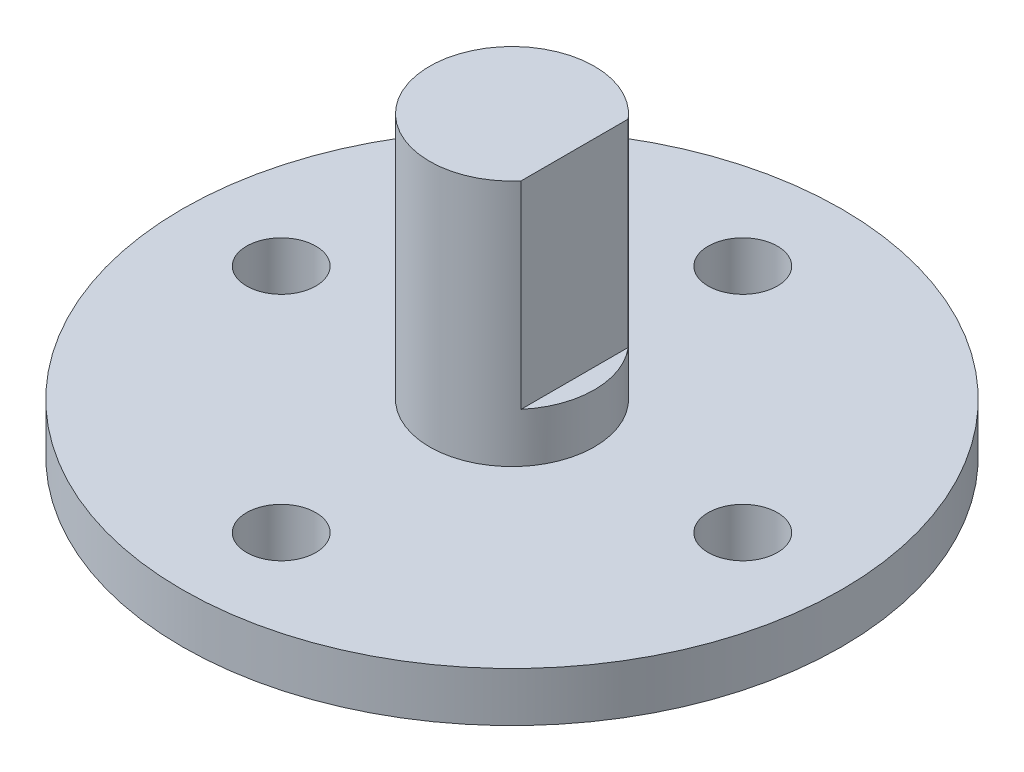
ISO-10303-21;
HEADER;
FILE_DESCRIPTION(('STEP AP214'),'2;1');
FILE_NAME('part.step','',(''),(''),'','','');
FILE_SCHEMA(('AUTOMOTIVE_DESIGN { 1 0 10303 214 1 1 1 1 }'));
ENDSEC;
DATA;
#1=APPLICATION_CONTEXT('core data for automotive mechanical design processes');
#2=APPLICATION_PROTOCOL_DEFINITION('international standard','automotive_design',2000,#1);
#3=PRODUCT_CONTEXT('',#1,'mechanical');
#4=PRODUCT('Part','Part','',(#3));
#5=PRODUCT_RELATED_PRODUCT_CATEGORY('part','',(#4));
#6=PRODUCT_DEFINITION_FORMATION('','',#4);
#7=PRODUCT_DEFINITION_CONTEXT('part definition',#1,'design');
#8=PRODUCT_DEFINITION('design','',#6,#7);
#9=PRODUCT_DEFINITION_SHAPE('','',#8);
#10=(LENGTH_UNIT() NAMED_UNIT(*) SI_UNIT(.MILLI.,.METRE.));
#11=(NAMED_UNIT(*) PLANE_ANGLE_UNIT() SI_UNIT($,.RADIAN.));
#12=(NAMED_UNIT(*) SI_UNIT($,.STERADIAN.) SOLID_ANGLE_UNIT());
#13=UNCERTAINTY_MEASURE_WITH_UNIT(LENGTH_MEASURE(1.E-05),#10,'distance_accuracy_value','');
#14=(GEOMETRIC_REPRESENTATION_CONTEXT(3) GLOBAL_UNCERTAINTY_ASSIGNED_CONTEXT((#13)) GLOBAL_UNIT_ASSIGNED_CONTEXT((#10,
#11,#12)) REPRESENTATION_CONTEXT('',''));
#15=CARTESIAN_POINT('',(0.,0.,0.));
#16=DIRECTION('',(0.,0.,1.));
#17=DIRECTION('',(1.,0.,0.));
#18=AXIS2_PLACEMENT_3D('',#15,#16,#17);
#19=CARTESIAN_POINT('',(0.,3.,0.));
#20=DIRECTION('',(0.,1.,0.));
#21=DIRECTION('',(0.,0.,1.));
#22=AXIS2_PLACEMENT_3D('',#19,#20,#21);
#23=PLANE('',#22);
#24=CARTESIAN_POINT('',(0.,3.,0.));
#25=DIRECTION('',(0.,1.,0.));
#26=DIRECTION('',(0.,0.,1.));
#27=AXIS2_PLACEMENT_3D('',#24,#25,#26);
#28=CIRCLE('',#27,5.);
#29=CARTESIAN_POINT('',(0.,3.,5.));
#30=VERTEX_POINT('',#29);
#31=EDGE_CURVE('E77',#30,#30,#28,.T.);
#32=ORIENTED_EDGE('',*,*,#31,.F.);
#33=EDGE_LOOP('',(#32));
#34=FACE_BOUND('',#33,.T.);
#35=CARTESIAN_POINT('',(14.,3.,0.));
#36=DIRECTION('',(0.,1.,0.));
#37=DIRECTION('',(0.,0.,1.));
#38=AXIS2_PLACEMENT_3D('',#35,#36,#37);
#39=CIRCLE('',#38,2.1);
#40=CARTESIAN_POINT('',(14.,3.,2.1000000000001));
#41=VERTEX_POINT('',#40);
#42=EDGE_CURVE('E92',#41,#41,#39,.T.);
#43=ORIENTED_EDGE('',*,*,#42,.F.);
#44=EDGE_LOOP('',(#43));
#45=FACE_BOUND('',#44,.T.);
#46=CARTESIAN_POINT('',(-14.,3.,0.));
#47=DIRECTION('',(0.,1.,0.));
#48=DIRECTION('',(0.,0.,1.));
#49=AXIS2_PLACEMENT_3D('',#46,#47,#48);
#50=CIRCLE('',#49,2.1);
#51=CARTESIAN_POINT('',(-14.,3.,2.1));
#52=VERTEX_POINT('',#51);
#53=EDGE_CURVE('E104',#52,#52,#50,.T.);
#54=ORIENTED_EDGE('',*,*,#53,.F.);
#55=EDGE_LOOP('',(#54));
#56=FACE_BOUND('',#55,.T.);
#57=CARTESIAN_POINT('',(0.,3.,0.));
#58=DIRECTION('',(0.,1.,0.));
#59=DIRECTION('',(0.,0.,1.));
#60=AXIS2_PLACEMENT_3D('',#57,#58,#59);
#61=CIRCLE('',#60,20.);
#62=CARTESIAN_POINT('',(0.,3.,20.));
#63=VERTEX_POINT('',#62);
#64=EDGE_CURVE('E11',#63,#63,#61,.T.);
#65=ORIENTED_EDGE('',*,*,#64,.T.);
#66=EDGE_LOOP('',(#65));
#67=FACE_BOUND('',#66,.T.);
#68=CARTESIAN_POINT('',(0.,3.,-14.));
#69=DIRECTION('',(0.,1.,0.));
#70=DIRECTION('',(0.,0.,1.));
#71=AXIS2_PLACEMENT_3D('',#68,#69,#70);
#72=CIRCLE('',#71,2.1);
#73=CARTESIAN_POINT('',(0.,3.,-11.9));
#74=VERTEX_POINT('',#73);
#75=EDGE_CURVE('E98',#74,#74,#72,.T.);
#76=ORIENTED_EDGE('',*,*,#75,.F.);
#77=EDGE_LOOP('',(#76));
#78=FACE_BOUND('',#77,.T.);
#79=CARTESIAN_POINT('',(-1.46642216231412E-13,3.,14.));
#80=DIRECTION('',(0.,1.,0.));
#81=DIRECTION('',(0.,0.,1.));
#82=AXIS2_PLACEMENT_3D('',#79,#80,#81);
#83=CIRCLE('',#82,2.1);
#84=CARTESIAN_POINT('',(-1.46642216231412E-13,3.,16.1));
#85=VERTEX_POINT('',#84);
#86=EDGE_CURVE('E83',#85,#85,#83,.T.);
#87=ORIENTED_EDGE('',*,*,#86,.F.);
#88=EDGE_LOOP('',(#87));
#89=FACE_BOUND('',#88,.T.);
#90=ADVANCED_FACE('F39',(#34,#45,#56,#67,#78,#89),#23,.T.);
#91=CARTESIAN_POINT('',(0.,0.,0.));
#92=DIRECTION('',(0.,1.,0.));
#93=DIRECTION('',(0.,0.,1.));
#94=AXIS2_PLACEMENT_3D('',#91,#92,#93);
#95=PLANE('',#94);
#96=CARTESIAN_POINT('',(0.,0.,0.));
#97=DIRECTION('',(0.,1.,0.));
#98=DIRECTION('',(0.,0.,1.));
#99=AXIS2_PLACEMENT_3D('',#96,#97,#98);
#100=CIRCLE('',#99,20.);
#101=CARTESIAN_POINT('',(0.,0.,20.));
#102=VERTEX_POINT('',#101);
#103=EDGE_CURVE('E43',#102,#102,#100,.T.);
#104=ORIENTED_EDGE('',*,*,#103,.F.);
#105=EDGE_LOOP('',(#104));
#106=FACE_BOUND('',#105,.T.);
#107=CARTESIAN_POINT('',(-14.,0.,0.));
#108=DIRECTION('',(0.,1.,0.));
#109=DIRECTION('',(0.,0.,1.));
#110=AXIS2_PLACEMENT_3D('',#107,#108,#109);
#111=CIRCLE('',#110,2.1);
#112=CARTESIAN_POINT('',(-14.,0.,2.1));
#113=VERTEX_POINT('',#112);
#114=EDGE_CURVE('E101',#113,#113,#111,.T.);
#115=ORIENTED_EDGE('',*,*,#114,.T.);
#116=EDGE_LOOP('',(#115));
#117=FACE_BOUND('',#116,.T.);
#118=CARTESIAN_POINT('',(0.,0.,-14.));
#119=DIRECTION('',(0.,1.,0.));
#120=DIRECTION('',(0.,0.,1.));
#121=AXIS2_PLACEMENT_3D('',#118,#119,#120);
#122=CIRCLE('',#121,2.1);
#123=CARTESIAN_POINT('',(0.,0.,-11.9));
#124=VERTEX_POINT('',#123);
#125=EDGE_CURVE('E95',#124,#124,#122,.T.);
#126=ORIENTED_EDGE('',*,*,#125,.T.);
#127=EDGE_LOOP('',(#126));
#128=FACE_BOUND('',#127,.T.);
#129=CARTESIAN_POINT('',(14.,0.,0.));
#130=DIRECTION('',(0.,1.,0.));
#131=DIRECTION('',(0.,0.,1.));
#132=AXIS2_PLACEMENT_3D('',#129,#130,#131);
#133=CIRCLE('',#132,2.1);
#134=CARTESIAN_POINT('',(14.,0.,2.1000000000001));
#135=VERTEX_POINT('',#134);
#136=EDGE_CURVE('E90',#135,#135,#133,.T.);
#137=ORIENTED_EDGE('',*,*,#136,.T.);
#138=EDGE_LOOP('',(#137));
#139=FACE_BOUND('',#138,.T.);
#140=CARTESIAN_POINT('',(-1.46642216231412E-13,0.,14.));
#141=DIRECTION('',(0.,1.,0.));
#142=DIRECTION('',(0.,0.,1.));
#143=AXIS2_PLACEMENT_3D('',#140,#141,#142);
#144=CIRCLE('',#143,2.1);
#145=CARTESIAN_POINT('',(-1.46642216231412E-13,0.,16.1));
#146=VERTEX_POINT('',#145);
#147=EDGE_CURVE('E80',#146,#146,#144,.T.);
#148=ORIENTED_EDGE('',*,*,#147,.T.);
#149=EDGE_LOOP('',(#148));
#150=FACE_BOUND('',#149,.T.);
#151=ADVANCED_FACE('F110',(#106,#117,#128,#139,#150),#95,.F.);
#152=CARTESIAN_POINT('',(0.,3.,0.));
#153=DIRECTION('',(0.,-1.,0.));
#154=DIRECTION('',(0.,0.,-1.));
#155=AXIS2_PLACEMENT_3D('',#152,#153,#154);
#156=CYLINDRICAL_SURFACE('',#155,20.);
#157=ORIENTED_EDGE('',*,*,#64,.F.);
#158=EDGE_LOOP('',(#157));
#159=FACE_BOUND('',#158,.T.);
#160=ORIENTED_EDGE('',*,*,#103,.T.);
#161=EDGE_LOOP('',(#160));
#162=FACE_BOUND('',#161,.T.);
#163=ADVANCED_FACE('F41',(#159,#162),#156,.T.);
#164=CARTESIAN_POINT('',(-14.,3.,0.));
#165=DIRECTION('',(0.,-1.,0.));
#166=DIRECTION('',(0.,0.,-1.));
#167=AXIS2_PLACEMENT_3D('',#164,#165,#166);
#168=CYLINDRICAL_SURFACE('',#167,2.1);
#169=ORIENTED_EDGE('',*,*,#53,.T.);
#170=EDGE_LOOP('',(#169));
#171=FACE_BOUND('',#170,.T.);
#172=ORIENTED_EDGE('',*,*,#114,.F.);
#173=EDGE_LOOP('',(#172));
#174=FACE_BOUND('',#173,.T.);
#175=ADVANCED_FACE('F113',(#171,#174),#168,.F.);
#176=CARTESIAN_POINT('',(0.,3.,-14.));
#177=DIRECTION('',(0.,-1.,0.));
#178=DIRECTION('',(0.,0.,-1.));
#179=AXIS2_PLACEMENT_3D('',#176,#177,#178);
#180=CYLINDRICAL_SURFACE('',#179,2.1);
#181=ORIENTED_EDGE('',*,*,#75,.T.);
#182=EDGE_LOOP('',(#181));
#183=FACE_BOUND('',#182,.T.);
#184=ORIENTED_EDGE('',*,*,#125,.F.);
#185=EDGE_LOOP('',(#184));
#186=FACE_BOUND('',#185,.T.);
#187=ADVANCED_FACE('F115',(#183,#186),#180,.F.);
#188=CARTESIAN_POINT('',(14.,3.,0.));
#189=DIRECTION('',(0.,-1.,0.));
#190=DIRECTION('',(0.,0.,-1.));
#191=AXIS2_PLACEMENT_3D('',#188,#189,#190);
#192=CYLINDRICAL_SURFACE('',#191,2.1);
#193=ORIENTED_EDGE('',*,*,#42,.T.);
#194=EDGE_LOOP('',(#193));
#195=FACE_BOUND('',#194,.T.);
#196=ORIENTED_EDGE('',*,*,#136,.F.);
#197=EDGE_LOOP('',(#196));
#198=FACE_BOUND('',#197,.T.);
#199=ADVANCED_FACE('F122',(#195,#198),#192,.F.);
#200=CARTESIAN_POINT('',(-1.46642216231412E-13,3.,14.));
#201=DIRECTION('',(0.,-1.,0.));
#202=DIRECTION('',(0.,0.,-1.));
#203=AXIS2_PLACEMENT_3D('',#200,#201,#202);
#204=CYLINDRICAL_SURFACE('',#203,2.1);
#205=ORIENTED_EDGE('',*,*,#86,.T.);
#206=EDGE_LOOP('',(#205));
#207=FACE_BOUND('',#206,.T.);
#208=ORIENTED_EDGE('',*,*,#147,.F.);
#209=EDGE_LOOP('',(#208));
#210=FACE_BOUND('',#209,.T.);
#211=ADVANCED_FACE('F147',(#207,#210),#204,.F.);
#212=CARTESIAN_POINT('',(0.,18.,0.));
#213=DIRECTION('',(0.,-1.,0.));
#214=DIRECTION('',(0.,0.,-1.));
#215=AXIS2_PLACEMENT_3D('',#212,#213,#214);
#216=CYLINDRICAL_SURFACE('',#215,5.);
#217=CARTESIAN_POINT('',(0.,18.,0.));
#218=DIRECTION('',(0.,1.,0.));
#219=DIRECTION('',(0.,0.,1.));
#220=AXIS2_PLACEMENT_3D('',#217,#218,#219);
#221=CIRCLE('',#220,5.);
#222=CARTESIAN_POINT('',(3.8,18.,-3.24961536185438));
#223=VERTEX_POINT('',#222);
#224=CARTESIAN_POINT('',(3.8,18.,3.24961536185438));
#225=VERTEX_POINT('',#224);
#226=EDGE_CURVE('E76',#223,#225,#221,.T.);
#227=ORIENTED_EDGE('',*,*,#226,.F.);
#228=DIRECTION('',(0.,1.,0.));
#229=VECTOR('',#228,1.);
#230=CARTESIAN_POINT('',(3.8,6.,-3.24961536185438));
#231=LINE('',#230,#229);
#232=CARTESIAN_POINT('',(3.8,6.,-3.24961536185438));
#233=VERTEX_POINT('',#232);
#234=EDGE_CURVE('E54',#233,#223,#231,.T.);
#235=ORIENTED_EDGE('',*,*,#234,.F.);
#236=CARTESIAN_POINT('',(0.,6.,0.));
#237=DIRECTION('',(0.,1.,0.));
#238=DIRECTION('',(0.,0.,1.));
#239=AXIS2_PLACEMENT_3D('',#236,#237,#238);
#240=CIRCLE('',#239,5.);
#241=CARTESIAN_POINT('',(3.8,6.,3.24961536185438));
#242=VERTEX_POINT('',#241);
#243=EDGE_CURVE('E70',#242,#233,#240,.T.);
#244=ORIENTED_EDGE('',*,*,#243,.F.);
#245=DIRECTION('',(0.,1.,0.));
#246=VECTOR('',#245,1.);
#247=CARTESIAN_POINT('',(3.8,6.,3.24961536185438));
#248=LINE('',#247,#246);
#249=EDGE_CURVE('E60',#242,#225,#248,.T.);
#250=ORIENTED_EDGE('',*,*,#249,.T.);
#251=EDGE_LOOP('',(#227,#235,#244,#250));
#252=FACE_BOUND('',#251,.T.);
#253=ORIENTED_EDGE('',*,*,#31,.T.);
#254=EDGE_LOOP('',(#253));
#255=FACE_BOUND('',#254,.T.);
#256=ADVANCED_FACE('F74',(#252,#255),#216,.T.);
#257=CARTESIAN_POINT('',(0.,18.,0.));
#258=DIRECTION('',(0.,1.,0.));
#259=DIRECTION('',(0.,0.,1.));
#260=AXIS2_PLACEMENT_3D('',#257,#258,#259);
#261=PLANE('',#260);
#262=DIRECTION('',(0.,0.,1.));
#263=VECTOR('',#262,1.);
#264=CARTESIAN_POINT('',(3.8,18.,-3.24961536185438));
#265=LINE('',#264,#263);
#266=EDGE_CURVE('E65',#223,#225,#265,.T.);
#267=ORIENTED_EDGE('',*,*,#266,.F.);
#268=ORIENTED_EDGE('',*,*,#226,.T.);
#269=EDGE_LOOP('',(#267,#268));
#270=FACE_BOUND('',#269,.T.);
#271=ADVANCED_FACE('F79',(#270),#261,.T.);
#272=CARTESIAN_POINT('',(3.8,6.,-3.24961536185438));
#273=DIRECTION('',(-1.,0.,0.));
#274=DIRECTION('',(0.,0.,1.));
#275=AXIS2_PLACEMENT_3D('',#272,#273,#274);
#276=PLANE('',#275);
#277=ORIENTED_EDGE('',*,*,#266,.T.);
#278=ORIENTED_EDGE('',*,*,#249,.F.);
#279=DIRECTION('',(0.,0.,1.));
#280=VECTOR('',#279,1.);
#281=CARTESIAN_POINT('',(3.8,6.,-3.24961536185438));
#282=LINE('',#281,#280);
#283=EDGE_CURVE('E168',#233,#242,#282,.T.);
#284=ORIENTED_EDGE('',*,*,#283,.F.);
#285=ORIENTED_EDGE('',*,*,#234,.T.);
#286=EDGE_LOOP('',(#277,#278,#284,#285));
#287=FACE_BOUND('',#286,.T.);
#288=ADVANCED_FACE('F66',(#287),#276,.F.);
#289=CARTESIAN_POINT('',(0.,6.,0.));
#290=DIRECTION('',(0.,1.,0.));
#291=DIRECTION('',(0.,0.,1.));
#292=AXIS2_PLACEMENT_3D('',#289,#290,#291);
#293=PLANE('',#292);
#294=ORIENTED_EDGE('',*,*,#243,.T.);
#295=ORIENTED_EDGE('',*,*,#283,.T.);
#296=EDGE_LOOP('',(#294,#295));
#297=FACE_BOUND('',#296,.T.);
#298=ADVANCED_FACE('F163',(#297),#293,.T.);
#299=CLOSED_SHELL('',(#90,#151,#163,#175,#187,#199,#211,#256,#271,#288,#298));
#300=MANIFOLD_SOLID_BREP('B2',#299);
#301=ADVANCED_BREP_SHAPE_REPRESENTATION('',(#18,#300),#14);
#302=SHAPE_DEFINITION_REPRESENTATION(#9,#301);
ENDSEC;
END-ISO-10303-21;
